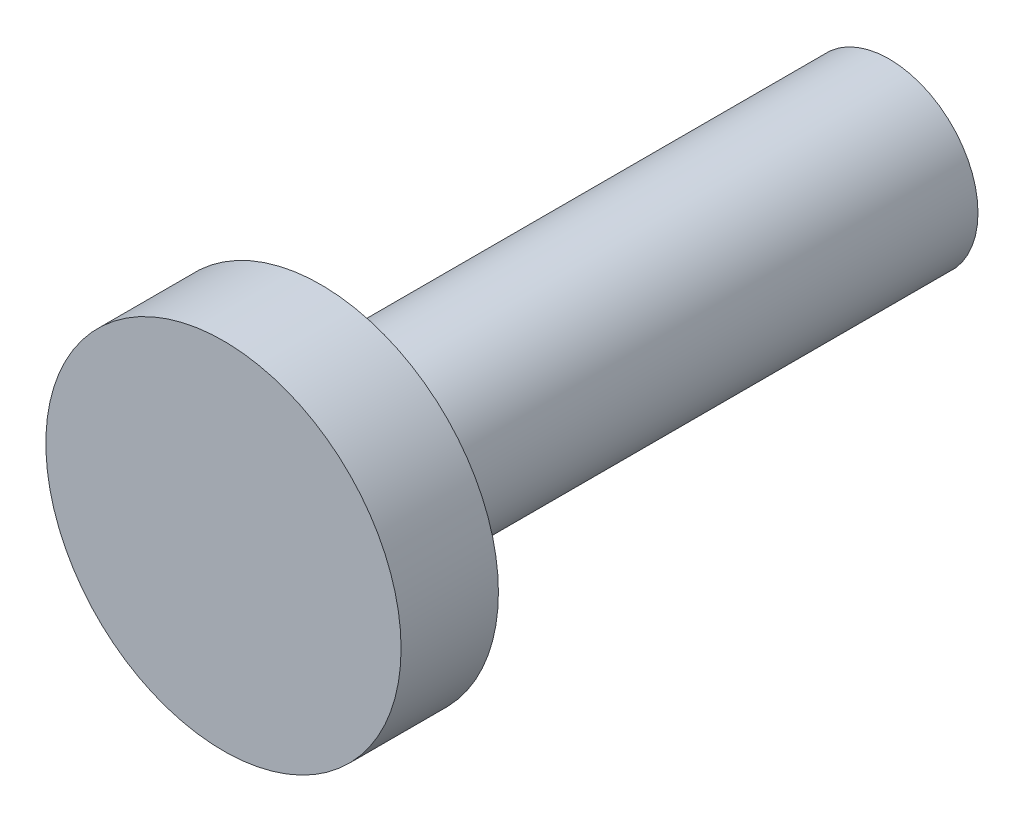
ISO-10303-21;
HEADER;
FILE_DESCRIPTION(('STEP AP214'),'2;1');
FILE_NAME('part.step','',(''),(''),'','','');
FILE_SCHEMA(('AUTOMOTIVE_DESIGN { 1 0 10303 214 1 1 1 1 }'));
ENDSEC;
DATA;
#1=APPLICATION_CONTEXT('core data for automotive mechanical design processes');
#2=APPLICATION_PROTOCOL_DEFINITION('international standard','automotive_design',2000,#1);
#3=PRODUCT_CONTEXT('',#1,'mechanical');
#4=PRODUCT('Part','Part','',(#3));
#5=PRODUCT_RELATED_PRODUCT_CATEGORY('part','',(#4));
#6=PRODUCT_DEFINITION_FORMATION('','',#4);
#7=PRODUCT_DEFINITION_CONTEXT('part definition',#1,'design');
#8=PRODUCT_DEFINITION('design','',#6,#7);
#9=PRODUCT_DEFINITION_SHAPE('','',#8);
#10=(LENGTH_UNIT() NAMED_UNIT(*) SI_UNIT(.MILLI.,.METRE.));
#11=(NAMED_UNIT(*) PLANE_ANGLE_UNIT() SI_UNIT($,.RADIAN.));
#12=(NAMED_UNIT(*) SI_UNIT($,.STERADIAN.) SOLID_ANGLE_UNIT());
#13=UNCERTAINTY_MEASURE_WITH_UNIT(LENGTH_MEASURE(1.E-05),#10,'distance_accuracy_value','');
#14=(GEOMETRIC_REPRESENTATION_CONTEXT(3) GLOBAL_UNCERTAINTY_ASSIGNED_CONTEXT((#13)) GLOBAL_UNIT_ASSIGNED_CONTEXT((#10,
#11,#12)) REPRESENTATION_CONTEXT('',''));
#15=CARTESIAN_POINT('',(0.,0.,0.));
#16=DIRECTION('',(0.,0.,1.));
#17=DIRECTION('',(1.,0.,0.));
#18=AXIS2_PLACEMENT_3D('',#15,#16,#17);
#19=CARTESIAN_POINT('',(0.,0.,1.37));
#20=DIRECTION('',(0.,0.,-1.));
#21=DIRECTION('',(-1.,0.,0.));
#22=AXIS2_PLACEMENT_3D('',#19,#20,#21);
#23=CYLINDRICAL_SURFACE('',#22,2.5);
#24=CARTESIAN_POINT('',(0.,0.,1.37));
#25=DIRECTION('',(0.,0.,1.));
#26=DIRECTION('',(1.,0.,0.));
#27=AXIS2_PLACEMENT_3D('',#24,#25,#26);
#28=CIRCLE('',#27,2.5);
#29=CARTESIAN_POINT('',(2.5,0.,1.37));
#30=VERTEX_POINT('',#29);
#31=EDGE_CURVE('E38',#30,#30,#28,.T.);
#32=ORIENTED_EDGE('',*,*,#31,.F.);
#33=EDGE_LOOP('',(#32));
#34=FACE_BOUND('',#33,.T.);
#35=CARTESIAN_POINT('',(0.,0.,0.));
#36=DIRECTION('',(0.,0.,1.));
#37=DIRECTION('',(1.,0.,0.));
#38=AXIS2_PLACEMENT_3D('',#35,#36,#37);
#39=CIRCLE('',#38,2.5);
#40=CARTESIAN_POINT('',(2.5,0.,0.));
#41=VERTEX_POINT('',#40);
#42=EDGE_CURVE('E34',#41,#41,#39,.T.);
#43=ORIENTED_EDGE('',*,*,#42,.T.);
#44=EDGE_LOOP('',(#43));
#45=FACE_BOUND('',#44,.T.);
#46=ADVANCED_FACE('F31',(#34,#45),#23,.T.);
#47=CARTESIAN_POINT('',(0.,0.,1.37));
#48=DIRECTION('',(0.,0.,1.));
#49=DIRECTION('',(1.,0.,0.));
#50=AXIS2_PLACEMENT_3D('',#47,#48,#49);
#51=PLANE('',#50);
#52=ORIENTED_EDGE('',*,*,#31,.T.);
#53=EDGE_LOOP('',(#52));
#54=FACE_BOUND('',#53,.T.);
#55=ADVANCED_FACE('F55',(#54),#51,.T.);
#56=CARTESIAN_POINT('',(0.,0.,0.));
#57=DIRECTION('',(0.,0.,1.));
#58=DIRECTION('',(1.,0.,0.));
#59=AXIS2_PLACEMENT_3D('',#56,#57,#58);
#60=PLANE('',#59);
#61=CARTESIAN_POINT('',(0.,0.,0.));
#62=DIRECTION('',(0.,0.,-1.));
#63=DIRECTION('',(-1.,0.,0.));
#64=AXIS2_PLACEMENT_3D('',#61,#62,#63);
#65=CIRCLE('',#64,1.25);
#66=CARTESIAN_POINT('',(-1.25,0.,0.));
#67=VERTEX_POINT('',#66);
#68=EDGE_CURVE('E10',#67,#67,#65,.T.);
#69=ORIENTED_EDGE('',*,*,#68,.F.);
#70=EDGE_LOOP('',(#69));
#71=FACE_BOUND('',#70,.T.);
#72=ORIENTED_EDGE('',*,*,#42,.F.);
#73=EDGE_LOOP('',(#72));
#74=FACE_BOUND('',#73,.T.);
#75=ADVANCED_FACE('F52',(#71,#74),#60,.F.);
#76=CARTESIAN_POINT('',(0.,0.,-8.));
#77=DIRECTION('',(0.,0.,1.));
#78=DIRECTION('',(1.,0.,0.));
#79=AXIS2_PLACEMENT_3D('',#76,#77,#78);
#80=CYLINDRICAL_SURFACE('',#79,1.25);
#81=CARTESIAN_POINT('',(0.,0.,-8.));
#82=DIRECTION('',(0.,0.,-1.));
#83=DIRECTION('',(-1.,0.,0.));
#84=AXIS2_PLACEMENT_3D('',#81,#82,#83);
#85=CIRCLE('',#84,1.25);
#86=CARTESIAN_POINT('',(-1.25,0.,-8.));
#87=VERTEX_POINT('',#86);
#88=EDGE_CURVE('E44',#87,#87,#85,.T.);
#89=ORIENTED_EDGE('',*,*,#88,.F.);
#90=EDGE_LOOP('',(#89));
#91=FACE_BOUND('',#90,.T.);
#92=ORIENTED_EDGE('',*,*,#68,.T.);
#93=EDGE_LOOP('',(#92));
#94=FACE_BOUND('',#93,.T.);
#95=ADVANCED_FACE('F54',(#91,#94),#80,.T.);
#96=CARTESIAN_POINT('',(0.,0.,-8.));
#97=DIRECTION('',(0.,0.,-1.));
#98=DIRECTION('',(-1.,0.,0.));
#99=AXIS2_PLACEMENT_3D('',#96,#97,#98);
#100=PLANE('',#99);
#101=ORIENTED_EDGE('',*,*,#88,.T.);
#102=EDGE_LOOP('',(#101));
#103=FACE_BOUND('',#102,.T.);
#104=ADVANCED_FACE('F61',(#103),#100,.T.);
#105=CLOSED_SHELL('',(#46,#55,#75,#95,#104));
#106=MANIFOLD_SOLID_BREP('B2',#105);
#107=ADVANCED_BREP_SHAPE_REPRESENTATION('',(#18,#106),#14);
#108=SHAPE_DEFINITION_REPRESENTATION(#9,#107);
ENDSEC;
END-ISO-10303-21;
